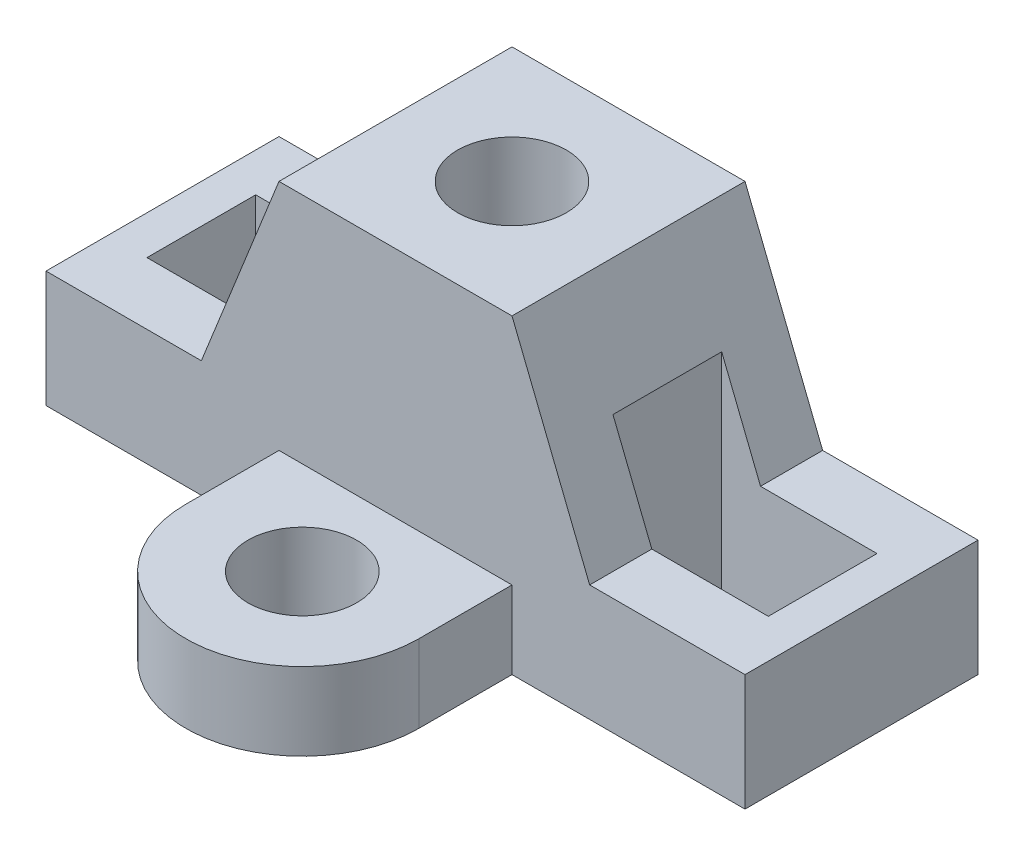
ISO-10303-21;
HEADER;
FILE_DESCRIPTION(('STEP AP214'),'2;1');
FILE_NAME('part.step','',(''),(''),'','','');
FILE_SCHEMA(('AUTOMOTIVE_DESIGN { 1 0 10303 214 1 1 1 1 }'));
ENDSEC;
DATA;
#1=APPLICATION_CONTEXT('core data for automotive mechanical design processes');
#2=APPLICATION_PROTOCOL_DEFINITION('international standard','automotive_design',2000,#1);
#3=PRODUCT_CONTEXT('',#1,'mechanical');
#4=PRODUCT('Part','Part','',(#3));
#5=PRODUCT_RELATED_PRODUCT_CATEGORY('part','',(#4));
#6=PRODUCT_DEFINITION_FORMATION('','',#4);
#7=PRODUCT_DEFINITION_CONTEXT('part definition',#1,'design');
#8=PRODUCT_DEFINITION('design','',#6,#7);
#9=PRODUCT_DEFINITION_SHAPE('','',#8);
#10=(LENGTH_UNIT() NAMED_UNIT(*) SI_UNIT(.MILLI.,.METRE.));
#11=(NAMED_UNIT(*) PLANE_ANGLE_UNIT() SI_UNIT($,.RADIAN.));
#12=(NAMED_UNIT(*) SI_UNIT($,.STERADIAN.) SOLID_ANGLE_UNIT());
#13=UNCERTAINTY_MEASURE_WITH_UNIT(LENGTH_MEASURE(1.E-05),#10,'distance_accuracy_value','');
#14=(GEOMETRIC_REPRESENTATION_CONTEXT(3) GLOBAL_UNCERTAINTY_ASSIGNED_CONTEXT((#13)) GLOBAL_UNIT_ASSIGNED_CONTEXT((#10,
#11,#12)) REPRESENTATION_CONTEXT('',''));
#15=CARTESIAN_POINT('',(0.,0.,0.));
#16=DIRECTION('',(0.,0.,1.));
#17=DIRECTION('',(1.,0.,0.));
#18=AXIS2_PLACEMENT_3D('',#15,#16,#17);
#19=CARTESIAN_POINT('',(25.,15.,-30.));
#20=DIRECTION('',(0.928476690885259,0.371390676354104,0.));
#21=DIRECTION('',(-0.371390676354104,0.928476690885259,0.));
#22=AXIS2_PLACEMENT_3D('',#19,#20,#21);
#23=PLANE('',#22);
#24=DIRECTION('',(-0.371390676354104,0.928476690885259,0.));
#25=VECTOR('',#24,1.);
#26=CARTESIAN_POINT('',(25.,15.,-22.));
#27=LINE('',#26,#25);
#28=CARTESIAN_POINT('',(25.,15.,-22.));
#29=VERTEX_POINT('',#28);
#30=CARTESIAN_POINT('',(20.,27.5,-22.));
#31=VERTEX_POINT('',#30);
#32=EDGE_CURVE('E299',#29,#31,#27,.T.);
#33=ORIENTED_EDGE('',*,*,#32,.F.);
#34=DIRECTION('',(0.,0.,1.));
#35=VECTOR('',#34,1.);
#36=CARTESIAN_POINT('',(25.,15.,-30.));
#37=LINE('',#36,#35);
#38=CARTESIAN_POINT('',(25.,15.,-30.));
#39=VERTEX_POINT('',#38);
#40=EDGE_CURVE('E365',#39,#29,#37,.T.);
#41=ORIENTED_EDGE('',*,*,#40,.F.);
#42=DIRECTION('',(-0.371390676354104,0.928476690885259,0.));
#43=VECTOR('',#42,1.);
#44=CARTESIAN_POINT('',(25.,15.,-30.));
#45=LINE('',#44,#43);
#46=CARTESIAN_POINT('',(15.,40.,-30.));
#47=VERTEX_POINT('',#46);
#48=EDGE_CURVE('E303',#39,#47,#45,.T.);
#49=ORIENTED_EDGE('',*,*,#48,.T.);
#50=DIRECTION('',(0.,0.,1.));
#51=VECTOR('',#50,1.);
#52=CARTESIAN_POINT('',(15.,40.,-30.));
#53=LINE('',#52,#51);
#54=CARTESIAN_POINT('',(15.,40.,0.));
#55=VERTEX_POINT('',#54);
#56=EDGE_CURVE('E336',#47,#55,#53,.T.);
#57=ORIENTED_EDGE('',*,*,#56,.T.);
#58=DIRECTION('',(-0.371390676354104,0.928476690885259,0.));
#59=VECTOR('',#58,1.);
#60=CARTESIAN_POINT('',(25.,15.,0.));
#61=LINE('',#60,#59);
#62=CARTESIAN_POINT('',(25.,15.,0.));
#63=VERTEX_POINT('',#62);
#64=EDGE_CURVE('E302',#63,#55,#61,.T.);
#65=ORIENTED_EDGE('',*,*,#64,.F.);
#66=CARTESIAN_POINT('',(25.,15.,-8.));
#67=VERTEX_POINT('',#66);
#68=EDGE_CURVE('E370',#67,#63,#37,.T.);
#69=ORIENTED_EDGE('',*,*,#68,.F.);
#70=DIRECTION('',(0.371390676354104,-0.928476690885259,0.));
#71=VECTOR('',#70,1.);
#72=CARTESIAN_POINT('',(25.,15.,-8.));
#73=LINE('',#72,#71);
#74=CARTESIAN_POINT('',(20.,27.5,-8.));
#75=VERTEX_POINT('',#74);
#76=EDGE_CURVE('E66',#75,#67,#73,.T.);
#77=ORIENTED_EDGE('',*,*,#76,.F.);
#78=DIRECTION('',(0.,0.,1.));
#79=VECTOR('',#78,1.);
#80=CARTESIAN_POINT('',(20.,27.5,-30.));
#81=LINE('',#80,#79);
#82=EDGE_CURVE('E285',#31,#75,#81,.T.);
#83=ORIENTED_EDGE('',*,*,#82,.F.);
#84=EDGE_LOOP('',(#33,#41,#49,#57,#65,#69,#77,#83));
#85=FACE_BOUND('',#84,.T.);
#86=ADVANCED_FACE('F43',(#85),#23,.T.);
#87=CARTESIAN_POINT('',(45.,15.,-30.));
#88=DIRECTION('',(0.,1.,0.));
#89=DIRECTION('',(-1.,0.,0.));
#90=AXIS2_PLACEMENT_3D('',#87,#88,#89);
#91=PLANE('',#90);
#92=DIRECTION('',(-1.,0.,0.));
#93=VECTOR('',#92,1.);
#94=CARTESIAN_POINT('',(45.,15.,-22.));
#95=LINE('',#94,#93);
#96=CARTESIAN_POINT('',(40.,15.,-22.));
#97=VERTEX_POINT('',#96);
#98=EDGE_CURVE('E296',#97,#29,#95,.T.);
#99=ORIENTED_EDGE('',*,*,#98,.F.);
#100=DIRECTION('',(0.,0.,-1.));
#101=VECTOR('',#100,1.);
#102=CARTESIAN_POINT('',(40.,15.,-30.));
#103=LINE('',#102,#101);
#104=CARTESIAN_POINT('',(40.,15.,-8.));
#105=VERTEX_POINT('',#104);
#106=EDGE_CURVE('E293',#105,#97,#103,.T.);
#107=ORIENTED_EDGE('',*,*,#106,.F.);
#108=DIRECTION('',(1.,0.,0.));
#109=VECTOR('',#108,1.);
#110=CARTESIAN_POINT('',(45.,15.,-8.));
#111=LINE('',#110,#109);
#112=EDGE_CURVE('E288',#67,#105,#111,.T.);
#113=ORIENTED_EDGE('',*,*,#112,.F.);
#114=ORIENTED_EDGE('',*,*,#68,.T.);
#115=DIRECTION('',(-1.,0.,0.));
#116=VECTOR('',#115,1.);
#117=CARTESIAN_POINT('',(45.,15.,0.));
#118=LINE('',#117,#116);
#119=CARTESIAN_POINT('',(45.,15.,0.));
#120=VERTEX_POINT('',#119);
#121=EDGE_CURVE('E308',#120,#63,#118,.T.);
#122=ORIENTED_EDGE('',*,*,#121,.F.);
#123=DIRECTION('',(0.,0.,1.));
#124=VECTOR('',#123,1.);
#125=CARTESIAN_POINT('',(45.,15.,-30.));
#126=LINE('',#125,#124);
#127=CARTESIAN_POINT('',(45.,15.,-30.));
#128=VERTEX_POINT('',#127);
#129=EDGE_CURVE('E371',#128,#120,#126,.T.);
#130=ORIENTED_EDGE('',*,*,#129,.F.);
#131=DIRECTION('',(-1.,0.,0.));
#132=VECTOR('',#131,1.);
#133=CARTESIAN_POINT('',(45.,15.,-30.));
#134=LINE('',#133,#132);
#135=EDGE_CURVE('E332',#128,#39,#134,.T.);
#136=ORIENTED_EDGE('',*,*,#135,.T.);
#137=ORIENTED_EDGE('',*,*,#40,.T.);
#138=EDGE_LOOP('',(#99,#107,#113,#114,#122,#130,#136,#137));
#139=FACE_BOUND('',#138,.T.);
#140=ADVANCED_FACE('F436',(#139),#91,.T.);
#141=CARTESIAN_POINT('',(45.,0.,-30.));
#142=DIRECTION('',(1.,0.,0.));
#143=DIRECTION('',(0.,0.,-1.));
#144=AXIS2_PLACEMENT_3D('',#141,#142,#143);
#145=PLANE('',#144);
#146=DIRECTION('',(0.,1.,0.));
#147=VECTOR('',#146,1.);
#148=CARTESIAN_POINT('',(45.,0.,0.));
#149=LINE('',#148,#147);
#150=CARTESIAN_POINT('',(45.,0.,0.));
#151=VERTEX_POINT('',#150);
#152=EDGE_CURVE('E358',#151,#120,#149,.T.);
#153=ORIENTED_EDGE('',*,*,#152,.F.);
#154=DIRECTION('',(0.,0.,1.));
#155=VECTOR('',#154,1.);
#156=CARTESIAN_POINT('',(45.,0.,-30.));
#157=LINE('',#156,#155);
#158=CARTESIAN_POINT('',(45.,0.,-30.));
#159=VERTEX_POINT('',#158);
#160=EDGE_CURVE('E374',#159,#151,#157,.T.);
#161=ORIENTED_EDGE('',*,*,#160,.F.);
#162=DIRECTION('',(0.,1.,0.));
#163=VECTOR('',#162,1.);
#164=CARTESIAN_POINT('',(45.,0.,-30.));
#165=LINE('',#164,#163);
#166=EDGE_CURVE('E328',#159,#128,#165,.T.);
#167=ORIENTED_EDGE('',*,*,#166,.T.);
#168=ORIENTED_EDGE('',*,*,#129,.T.);
#169=EDGE_LOOP('',(#153,#161,#167,#168));
#170=FACE_BOUND('',#169,.T.);
#171=ADVANCED_FACE('F459',(#170),#145,.T.);
#172=CARTESIAN_POINT('',(-45.,0.,-30.));
#173=DIRECTION('',(0.,-1.,0.));
#174=DIRECTION('',(0.,0.,-1.));
#175=AXIS2_PLACEMENT_3D('',#172,#173,#174);
#176=PLANE('',#175);
#177=CARTESIAN_POINT('',(0.,0.,-15.));
#178=DIRECTION('',(0.,-1.,0.));
#179=DIRECTION('',(0.,0.,-1.));
#180=AXIS2_PLACEMENT_3D('',#177,#178,#179);
#181=CIRCLE('',#180,7.);
#182=CARTESIAN_POINT('',(0.,0.,-22.));
#183=VERTEX_POINT('',#182);
#184=EDGE_CURVE('E226',#183,#183,#181,.F.);
#185=ORIENTED_EDGE('',*,*,#184,.T.);
#186=EDGE_LOOP('',(#185));
#187=FACE_BOUND('',#186,.T.);
#188=DIRECTION('',(0.,0.,-1.));
#189=VECTOR('',#188,1.);
#190=CARTESIAN_POINT('',(-40.,0.,-30.));
#191=LINE('',#190,#189);
#192=CARTESIAN_POINT('',(-40.,0.,-8.));
#193=VERTEX_POINT('',#192);
#194=CARTESIAN_POINT('',(-40.,0.,-22.));
#195=VERTEX_POINT('',#194);
#196=EDGE_CURVE('E282',#193,#195,#191,.T.);
#197=ORIENTED_EDGE('',*,*,#196,.F.);
#198=DIRECTION('',(-1.,0.,0.));
#199=VECTOR('',#198,1.);
#200=CARTESIAN_POINT('',(-45.,0.,-8.));
#201=LINE('',#200,#199);
#202=CARTESIAN_POINT('',(-20.,0.,-8.));
#203=VERTEX_POINT('',#202);
#204=EDGE_CURVE('E269',#203,#193,#201,.T.);
#205=ORIENTED_EDGE('',*,*,#204,.F.);
#206=DIRECTION('',(0.,0.,1.));
#207=VECTOR('',#206,1.);
#208=CARTESIAN_POINT('',(-20.,0.,-30.));
#209=LINE('',#208,#207);
#210=CARTESIAN_POINT('',(-20.,0.,-22.));
#211=VERTEX_POINT('',#210);
#212=EDGE_CURVE('E272',#211,#203,#209,.T.);
#213=ORIENTED_EDGE('',*,*,#212,.F.);
#214=DIRECTION('',(1.,0.,0.));
#215=VECTOR('',#214,1.);
#216=CARTESIAN_POINT('',(-45.,0.,-22.));
#217=LINE('',#216,#215);
#218=EDGE_CURVE('E279',#195,#211,#217,.T.);
#219=ORIENTED_EDGE('',*,*,#218,.F.);
#220=EDGE_LOOP('',(#197,#205,#213,#219));
#221=FACE_BOUND('',#220,.T.);
#222=DIRECTION('',(1.,0.,0.));
#223=VECTOR('',#222,1.);
#224=CARTESIAN_POINT('',(-45.,0.,-22.));
#225=LINE('',#224,#223);
#226=CARTESIAN_POINT('',(20.,0.,-22.));
#227=VERTEX_POINT('',#226);
#228=CARTESIAN_POINT('',(40.,0.,-22.));
#229=VERTEX_POINT('',#228);
#230=EDGE_CURVE('E11',#227,#229,#225,.T.);
#231=ORIENTED_EDGE('',*,*,#230,.F.);
#232=DIRECTION('',(0.,0.,-1.));
#233=VECTOR('',#232,1.);
#234=CARTESIAN_POINT('',(20.,0.,-30.));
#235=LINE('',#234,#233);
#236=CARTESIAN_POINT('',(20.,0.,-8.));
#237=VERTEX_POINT('',#236);
#238=EDGE_CURVE('E405',#237,#227,#235,.T.);
#239=ORIENTED_EDGE('',*,*,#238,.F.);
#240=DIRECTION('',(-1.,0.,0.));
#241=VECTOR('',#240,1.);
#242=CARTESIAN_POINT('',(-45.,0.,-8.00000000000001));
#243=LINE('',#242,#241);
#244=CARTESIAN_POINT('',(40.,0.,-8.));
#245=VERTEX_POINT('',#244);
#246=EDGE_CURVE('E408',#245,#237,#243,.T.);
#247=ORIENTED_EDGE('',*,*,#246,.F.);
#248=DIRECTION('',(0.,0.,1.));
#249=VECTOR('',#248,1.);
#250=CARTESIAN_POINT('',(40.,0.,-30.));
#251=LINE('',#250,#249);
#252=EDGE_CURVE('E51',#229,#245,#251,.T.);
#253=ORIENTED_EDGE('',*,*,#252,.F.);
#254=EDGE_LOOP('',(#231,#239,#247,#253));
#255=FACE_BOUND('',#254,.T.);
#256=DIRECTION('',(1.,0.,0.));
#257=VECTOR('',#256,1.);
#258=CARTESIAN_POINT('',(-45.,0.,0.));
#259=LINE('',#258,#257);
#260=CARTESIAN_POINT('',(-45.,0.,0.));
#261=VERTEX_POINT('',#260);
#262=CARTESIAN_POINT('',(-15.,0.,0.));
#263=VERTEX_POINT('',#262);
#264=EDGE_CURVE('E219',#261,#263,#259,.T.);
#265=ORIENTED_EDGE('',*,*,#264,.F.);
#266=DIRECTION('',(0.,0.,1.));
#267=VECTOR('',#266,1.);
#268=CARTESIAN_POINT('',(-45.,0.,-30.));
#269=LINE('',#268,#267);
#270=CARTESIAN_POINT('',(-45.,0.,-30.));
#271=VERTEX_POINT('',#270);
#272=EDGE_CURVE('E378',#271,#261,#269,.T.);
#273=ORIENTED_EDGE('',*,*,#272,.F.);
#274=DIRECTION('',(1.,0.,0.));
#275=VECTOR('',#274,1.);
#276=CARTESIAN_POINT('',(-45.,0.,-30.));
#277=LINE('',#276,#275);
#278=EDGE_CURVE('E324',#271,#159,#277,.T.);
#279=ORIENTED_EDGE('',*,*,#278,.T.);
#280=ORIENTED_EDGE('',*,*,#160,.T.);
#281=CARTESIAN_POINT('',(15.,0.,0.));
#282=VERTEX_POINT('',#281);
#283=EDGE_CURVE('E355',#282,#151,#259,.T.);
#284=ORIENTED_EDGE('',*,*,#283,.F.);
#285=DIRECTION('',(0.,0.,-1.));
#286=VECTOR('',#285,1.);
#287=CARTESIAN_POINT('',(15.,0.,0.));
#288=LINE('',#287,#286);
#289=CARTESIAN_POINT('',(15.,0.,12.));
#290=VERTEX_POINT('',#289);
#291=EDGE_CURVE('E58',#290,#282,#288,.T.);
#292=ORIENTED_EDGE('',*,*,#291,.F.);
#293=CARTESIAN_POINT('',(0.,0.,12.));
#294=DIRECTION('',(0.,1.,0.));
#295=DIRECTION('',(0.,0.,1.));
#296=AXIS2_PLACEMENT_3D('',#293,#294,#295);
#297=CIRCLE('',#296,15.);
#298=CARTESIAN_POINT('',(-15.,0.,12.));
#299=VERTEX_POINT('',#298);
#300=EDGE_CURVE('E745',#299,#290,#297,.T.);
#301=ORIENTED_EDGE('',*,*,#300,.F.);
#302=DIRECTION('',(0.,0.,1.));
#303=VECTOR('',#302,1.);
#304=CARTESIAN_POINT('',(-15.,0.,0.));
#305=LINE('',#304,#303);
#306=EDGE_CURVE('E744',#263,#299,#305,.T.);
#307=ORIENTED_EDGE('',*,*,#306,.F.);
#308=EDGE_LOOP('',(#265,#273,#279,#280,#284,#292,#301,#307));
#309=FACE_BOUND('',#308,.T.);
#310=CARTESIAN_POINT('',(0.,0.,12.));
#311=DIRECTION('',(0.,1.,0.));
#312=DIRECTION('',(0.,0.,1.));
#313=AXIS2_PLACEMENT_3D('',#310,#311,#312);
#314=CIRCLE('',#313,7.);
#315=CARTESIAN_POINT('',(0.,0.,19.));
#316=VERTEX_POINT('',#315);
#317=EDGE_CURVE('E753',#316,#316,#314,.T.);
#318=ORIENTED_EDGE('',*,*,#317,.T.);
#319=EDGE_LOOP('',(#318));
#320=FACE_BOUND('',#319,.T.);
#321=ADVANCED_FACE('F423',(#187,#221,#255,#309,#320),#176,.T.);
#322=CARTESIAN_POINT('',(-45.,15.,-30.));
#323=DIRECTION('',(-1.,0.,0.));
#324=DIRECTION('',(0.,0.,1.));
#325=AXIS2_PLACEMENT_3D('',#322,#323,#324);
#326=PLANE('',#325);
#327=DIRECTION('',(0.,-1.,0.));
#328=VECTOR('',#327,1.);
#329=CARTESIAN_POINT('',(-45.,15.,0.));
#330=LINE('',#329,#328);
#331=CARTESIAN_POINT('',(-45.,15.,0.));
#332=VERTEX_POINT('',#331);
#333=EDGE_CURVE('E352',#332,#261,#330,.T.);
#334=ORIENTED_EDGE('',*,*,#333,.F.);
#335=DIRECTION('',(0.,0.,1.));
#336=VECTOR('',#335,1.);
#337=CARTESIAN_POINT('',(-45.,15.,-30.));
#338=LINE('',#337,#336);
#339=CARTESIAN_POINT('',(-45.,15.,-30.));
#340=VERTEX_POINT('',#339);
#341=EDGE_CURVE('E381',#340,#332,#338,.T.);
#342=ORIENTED_EDGE('',*,*,#341,.F.);
#343=DIRECTION('',(0.,-1.,0.));
#344=VECTOR('',#343,1.);
#345=CARTESIAN_POINT('',(-45.,15.,-30.));
#346=LINE('',#345,#344);
#347=EDGE_CURVE('E320',#340,#271,#346,.T.);
#348=ORIENTED_EDGE('',*,*,#347,.T.);
#349=ORIENTED_EDGE('',*,*,#272,.T.);
#350=EDGE_LOOP('',(#334,#342,#348,#349));
#351=FACE_BOUND('',#350,.T.);
#352=ADVANCED_FACE('F466',(#351),#326,.T.);
#353=CARTESIAN_POINT('',(-25.,15.,-30.));
#354=DIRECTION('',(0.,1.,0.));
#355=DIRECTION('',(0.,0.,1.));
#356=AXIS2_PLACEMENT_3D('',#353,#354,#355);
#357=PLANE('',#356);
#358=DIRECTION('',(-1.,0.,0.));
#359=VECTOR('',#358,1.);
#360=CARTESIAN_POINT('',(-25.,15.,-22.));
#361=LINE('',#360,#359);
#362=CARTESIAN_POINT('',(-25.,15.,-22.));
#363=VERTEX_POINT('',#362);
#364=CARTESIAN_POINT('',(-40.,15.,-22.));
#365=VERTEX_POINT('',#364);
#366=EDGE_CURVE('E276',#363,#365,#361,.T.);
#367=ORIENTED_EDGE('',*,*,#366,.F.);
#368=DIRECTION('',(0.,0.,1.));
#369=VECTOR('',#368,1.);
#370=CARTESIAN_POINT('',(-25.,15.,-30.));
#371=LINE('',#370,#369);
#372=CARTESIAN_POINT('',(-25.,15.,-30.));
#373=VERTEX_POINT('',#372);
#374=EDGE_CURVE('E384',#373,#363,#371,.T.);
#375=ORIENTED_EDGE('',*,*,#374,.F.);
#376=DIRECTION('',(-1.,0.,0.));
#377=VECTOR('',#376,1.);
#378=CARTESIAN_POINT('',(-25.,15.,-30.));
#379=LINE('',#378,#377);
#380=EDGE_CURVE('E316',#373,#340,#379,.T.);
#381=ORIENTED_EDGE('',*,*,#380,.T.);
#382=ORIENTED_EDGE('',*,*,#341,.T.);
#383=DIRECTION('',(-1.,0.,0.));
#384=VECTOR('',#383,1.);
#385=CARTESIAN_POINT('',(-25.,15.,0.));
#386=LINE('',#385,#384);
#387=CARTESIAN_POINT('',(-25.,15.,0.));
#388=VERTEX_POINT('',#387);
#389=EDGE_CURVE('E348',#388,#332,#386,.T.);
#390=ORIENTED_EDGE('',*,*,#389,.F.);
#391=CARTESIAN_POINT('',(-25.,15.,-8.));
#392=VERTEX_POINT('',#391);
#393=EDGE_CURVE('E388',#392,#388,#371,.T.);
#394=ORIENTED_EDGE('',*,*,#393,.F.);
#395=DIRECTION('',(1.,0.,0.));
#396=VECTOR('',#395,1.);
#397=CARTESIAN_POINT('',(-25.,15.,-8.));
#398=LINE('',#397,#396);
#399=CARTESIAN_POINT('',(-40.,15.,-8.));
#400=VERTEX_POINT('',#399);
#401=EDGE_CURVE('E240',#400,#392,#398,.T.);
#402=ORIENTED_EDGE('',*,*,#401,.F.);
#403=DIRECTION('',(0.,0.,1.));
#404=VECTOR('',#403,1.);
#405=CARTESIAN_POINT('',(-40.,15.,-30.));
#406=LINE('',#405,#404);
#407=EDGE_CURVE('E402',#365,#400,#406,.T.);
#408=ORIENTED_EDGE('',*,*,#407,.F.);
#409=EDGE_LOOP('',(#367,#375,#381,#382,#390,#394,#402,#408));
#410=FACE_BOUND('',#409,.T.);
#411=ADVANCED_FACE('F485',(#410),#357,.T.);
#412=CARTESIAN_POINT('',(-15.,40.,-30.));
#413=DIRECTION('',(-0.928476690885259,0.371390676354104,0.));
#414=DIRECTION('',(-0.371390676354104,-0.928476690885259,0.));
#415=AXIS2_PLACEMENT_3D('',#412,#413,#414);
#416=PLANE('',#415);
#417=DIRECTION('',(-0.371390676354104,-0.928476690885259,0.));
#418=VECTOR('',#417,1.);
#419=CARTESIAN_POINT('',(-15.,40.,-22.));
#420=LINE('',#419,#418);
#421=CARTESIAN_POINT('',(-20.,27.5,-22.));
#422=VERTEX_POINT('',#421);
#423=EDGE_CURVE('E399',#422,#363,#420,.T.);
#424=ORIENTED_EDGE('',*,*,#423,.F.);
#425=DIRECTION('',(0.,0.,-1.));
#426=VECTOR('',#425,1.);
#427=CARTESIAN_POINT('',(-20.,27.5,-30.));
#428=LINE('',#427,#426);
#429=CARTESIAN_POINT('',(-20.,27.4999999999999,-8.));
#430=VERTEX_POINT('',#429);
#431=EDGE_CURVE('E396',#430,#422,#428,.T.);
#432=ORIENTED_EDGE('',*,*,#431,.F.);
#433=DIRECTION('',(0.371390676354104,0.928476690885259,0.));
#434=VECTOR('',#433,1.);
#435=CARTESIAN_POINT('',(-15.,40.,-8.));
#436=LINE('',#435,#434);
#437=EDGE_CURVE('E369',#392,#430,#436,.T.);
#438=ORIENTED_EDGE('',*,*,#437,.F.);
#439=ORIENTED_EDGE('',*,*,#393,.T.);
#440=DIRECTION('',(-0.371390676354104,-0.928476690885259,0.));
#441=VECTOR('',#440,1.);
#442=CARTESIAN_POINT('',(-15.,40.,0.));
#443=LINE('',#442,#441);
#444=CARTESIAN_POINT('',(-15.,40.,0.));
#445=VERTEX_POINT('',#444);
#446=EDGE_CURVE('E344',#445,#388,#443,.T.);
#447=ORIENTED_EDGE('',*,*,#446,.F.);
#448=DIRECTION('',(0.,0.,1.));
#449=VECTOR('',#448,1.);
#450=CARTESIAN_POINT('',(-15.,40.,-30.));
#451=LINE('',#450,#449);
#452=CARTESIAN_POINT('',(-15.,40.,-30.));
#453=VERTEX_POINT('',#452);
#454=EDGE_CURVE('E389',#453,#445,#451,.T.);
#455=ORIENTED_EDGE('',*,*,#454,.F.);
#456=DIRECTION('',(-0.371390676354104,-0.928476690885259,0.));
#457=VECTOR('',#456,1.);
#458=CARTESIAN_POINT('',(-15.,40.,-30.));
#459=LINE('',#458,#457);
#460=EDGE_CURVE('E312',#453,#373,#459,.T.);
#461=ORIENTED_EDGE('',*,*,#460,.T.);
#462=ORIENTED_EDGE('',*,*,#374,.T.);
#463=EDGE_LOOP('',(#424,#432,#438,#439,#447,#455,#461,#462));
#464=FACE_BOUND('',#463,.T.);
#465=ADVANCED_FACE('F490',(#464),#416,.T.);
#466=CARTESIAN_POINT('',(15.,40.,-30.));
#467=DIRECTION('',(0.,1.,0.));
#468=DIRECTION('',(0.,0.,1.));
#469=AXIS2_PLACEMENT_3D('',#466,#467,#468);
#470=PLANE('',#469);
#471=CARTESIAN_POINT('',(0.,40.,-15.));
#472=DIRECTION('',(0.,1.,0.));
#473=DIRECTION('',(0.,0.,1.));
#474=AXIS2_PLACEMENT_3D('',#471,#472,#473);
#475=CIRCLE('',#474,7.);
#476=CARTESIAN_POINT('',(0.,40.,-8.));
#477=VERTEX_POINT('',#476);
#478=EDGE_CURVE('E221',#477,#477,#475,.T.);
#479=ORIENTED_EDGE('',*,*,#478,.F.);
#480=EDGE_LOOP('',(#479));
#481=FACE_BOUND('',#480,.T.);
#482=DIRECTION('',(-1.,0.,0.));
#483=VECTOR('',#482,1.);
#484=CARTESIAN_POINT('',(15.,40.,0.));
#485=LINE('',#484,#483);
#486=EDGE_CURVE('E340',#55,#445,#485,.T.);
#487=ORIENTED_EDGE('',*,*,#486,.F.);
#488=ORIENTED_EDGE('',*,*,#56,.F.);
#489=DIRECTION('',(-1.,0.,0.));
#490=VECTOR('',#489,1.);
#491=CARTESIAN_POINT('',(15.,40.,-30.));
#492=LINE('',#491,#490);
#493=EDGE_CURVE('E307',#47,#453,#492,.T.);
#494=ORIENTED_EDGE('',*,*,#493,.T.);
#495=ORIENTED_EDGE('',*,*,#454,.T.);
#496=EDGE_LOOP('',(#487,#488,#494,#495));
#497=FACE_BOUND('',#496,.T.);
#498=ADVANCED_FACE('F449',(#481,#497),#470,.T.);
#499=CARTESIAN_POINT('',(0.,0.,-30.));
#500=DIRECTION('',(0.,0.,1.));
#501=DIRECTION('',(1.,0.,0.));
#502=AXIS2_PLACEMENT_3D('',#499,#500,#501);
#503=PLANE('',#502);
#504=ORIENTED_EDGE('',*,*,#48,.F.);
#505=ORIENTED_EDGE('',*,*,#135,.F.);
#506=ORIENTED_EDGE('',*,*,#166,.F.);
#507=ORIENTED_EDGE('',*,*,#278,.F.);
#508=ORIENTED_EDGE('',*,*,#347,.F.);
#509=ORIENTED_EDGE('',*,*,#380,.F.);
#510=ORIENTED_EDGE('',*,*,#460,.F.);
#511=ORIENTED_EDGE('',*,*,#493,.F.);
#512=EDGE_LOOP('',(#504,#505,#506,#507,#508,#509,#510,#511));
#513=FACE_BOUND('',#512,.T.);
#514=ADVANCED_FACE('F441',(#513),#503,.F.);
#515=CARTESIAN_POINT('',(0.,0.,0.));
#516=DIRECTION('',(0.,0.,1.));
#517=DIRECTION('',(1.,0.,0.));
#518=AXIS2_PLACEMENT_3D('',#515,#516,#517);
#519=PLANE('',#518);
#520=DIRECTION('',(0.,-1.,0.));
#521=VECTOR('',#520,1.);
#522=CARTESIAN_POINT('',(-15.,10.,0.));
#523=LINE('',#522,#521);
#524=CARTESIAN_POINT('',(-15.,10.,0.));
#525=VERTEX_POINT('',#524);
#526=EDGE_CURVE('E198',#525,#263,#523,.T.);
#527=ORIENTED_EDGE('',*,*,#526,.F.);
#528=DIRECTION('',(-1.,0.,0.));
#529=VECTOR('',#528,1.);
#530=CARTESIAN_POINT('',(-15.,10.,0.));
#531=LINE('',#530,#529);
#532=CARTESIAN_POINT('',(15.,10.,0.));
#533=VERTEX_POINT('',#532);
#534=EDGE_CURVE('E206',#533,#525,#531,.T.);
#535=ORIENTED_EDGE('',*,*,#534,.F.);
#536=DIRECTION('',(0.,-1.,0.));
#537=VECTOR('',#536,1.);
#538=CARTESIAN_POINT('',(15.,10.,0.));
#539=LINE('',#538,#537);
#540=EDGE_CURVE('E456',#533,#282,#539,.T.);
#541=ORIENTED_EDGE('',*,*,#540,.T.);
#542=ORIENTED_EDGE('',*,*,#283,.T.);
#543=ORIENTED_EDGE('',*,*,#152,.T.);
#544=ORIENTED_EDGE('',*,*,#121,.T.);
#545=ORIENTED_EDGE('',*,*,#64,.T.);
#546=ORIENTED_EDGE('',*,*,#486,.T.);
#547=ORIENTED_EDGE('',*,*,#446,.T.);
#548=ORIENTED_EDGE('',*,*,#389,.T.);
#549=ORIENTED_EDGE('',*,*,#333,.T.);
#550=ORIENTED_EDGE('',*,*,#264,.T.);
#551=EDGE_LOOP('',(#527,#535,#541,#542,#543,#544,#545,#546,#547,#548,#549,#550));
#552=FACE_BOUND('',#551,.T.);
#553=ADVANCED_FACE('F216',(#552),#519,.T.);
#554=CARTESIAN_POINT('',(-40.,-1.2E-05,-8.));
#555=DIRECTION('',(-1.,0.,0.));
#556=DIRECTION('',(0.,0.,1.));
#557=AXIS2_PLACEMENT_3D('',#554,#555,#556);
#558=PLANE('',#557);
#559=ORIENTED_EDGE('',*,*,#196,.T.);
#560=DIRECTION('',(0.,1.,0.));
#561=VECTOR('',#560,1.);
#562=CARTESIAN_POINT('',(-40.,-1.2E-05,-22.));
#563=LINE('',#562,#561);
#564=EDGE_CURVE('E236',#195,#365,#563,.T.);
#565=ORIENTED_EDGE('',*,*,#564,.T.);
#566=ORIENTED_EDGE('',*,*,#407,.T.);
#567=DIRECTION('',(0.,1.,0.));
#568=VECTOR('',#567,1.);
#569=CARTESIAN_POINT('',(-40.,-1.2E-05,-8.));
#570=LINE('',#569,#568);
#571=EDGE_CURVE('E249',#193,#400,#570,.T.);
#572=ORIENTED_EDGE('',*,*,#571,.F.);
#573=EDGE_LOOP('',(#559,#565,#566,#572));
#574=FACE_BOUND('',#573,.T.);
#575=ADVANCED_FACE('F511',(#574),#558,.F.);
#576=CARTESIAN_POINT('',(-40.,-1.2E-05,-22.));
#577=DIRECTION('',(0.,0.,-1.));
#578=DIRECTION('',(-1.,0.,0.));
#579=AXIS2_PLACEMENT_3D('',#576,#577,#578);
#580=PLANE('',#579);
#581=ORIENTED_EDGE('',*,*,#218,.T.);
#582=DIRECTION('',(0.,1.,0.));
#583=VECTOR('',#582,1.);
#584=CARTESIAN_POINT('',(-20.,-1.2E-05,-22.));
#585=LINE('',#584,#583);
#586=EDGE_CURVE('E241',#211,#422,#585,.T.);
#587=ORIENTED_EDGE('',*,*,#586,.T.);
#588=ORIENTED_EDGE('',*,*,#423,.T.);
#589=ORIENTED_EDGE('',*,*,#366,.T.);
#590=ORIENTED_EDGE('',*,*,#564,.F.);
#591=EDGE_LOOP('',(#581,#587,#588,#589,#590));
#592=FACE_BOUND('',#591,.T.);
#593=ADVANCED_FACE('F516',(#592),#580,.F.);
#594=CARTESIAN_POINT('',(-20.,-1.2E-05,-22.));
#595=DIRECTION('',(1.,0.,0.));
#596=DIRECTION('',(0.,0.,-1.));
#597=AXIS2_PLACEMENT_3D('',#594,#595,#596);
#598=PLANE('',#597);
#599=ORIENTED_EDGE('',*,*,#212,.T.);
#600=DIRECTION('',(0.,1.,0.));
#601=VECTOR('',#600,1.);
#602=CARTESIAN_POINT('',(-20.,-1.2E-05,-8.));
#603=LINE('',#602,#601);
#604=EDGE_CURVE('E245',#203,#430,#603,.T.);
#605=ORIENTED_EDGE('',*,*,#604,.T.);
#606=ORIENTED_EDGE('',*,*,#431,.T.);
#607=ORIENTED_EDGE('',*,*,#586,.F.);
#608=EDGE_LOOP('',(#599,#605,#606,#607));
#609=FACE_BOUND('',#608,.T.);
#610=ADVANCED_FACE('F529',(#609),#598,.F.);
#611=CARTESIAN_POINT('',(-20.,-1.2E-05,-8.));
#612=DIRECTION('',(0.,0.,1.));
#613=DIRECTION('',(1.,0.,0.));
#614=AXIS2_PLACEMENT_3D('',#611,#612,#613);
#615=PLANE('',#614);
#616=ORIENTED_EDGE('',*,*,#204,.T.);
#617=ORIENTED_EDGE('',*,*,#571,.T.);
#618=ORIENTED_EDGE('',*,*,#401,.T.);
#619=ORIENTED_EDGE('',*,*,#437,.T.);
#620=ORIENTED_EDGE('',*,*,#604,.F.);
#621=EDGE_LOOP('',(#616,#617,#618,#619,#620));
#622=FACE_BOUND('',#621,.T.);
#623=ADVANCED_FACE('F540',(#622),#615,.F.);
#624=CARTESIAN_POINT('',(40.,-1.2E-05,-22.));
#625=DIRECTION('',(0.,0.,-1.));
#626=DIRECTION('',(-1.,0.,0.));
#627=AXIS2_PLACEMENT_3D('',#624,#625,#626);
#628=PLANE('',#627);
#629=ORIENTED_EDGE('',*,*,#32,.T.);
#630=DIRECTION('',(0.,1.,0.));
#631=VECTOR('',#630,1.);
#632=CARTESIAN_POINT('',(20.,-1.2E-05,-22.));
#633=LINE('',#632,#631);
#634=EDGE_CURVE('E253',#227,#31,#633,.T.);
#635=ORIENTED_EDGE('',*,*,#634,.F.);
#636=ORIENTED_EDGE('',*,*,#230,.T.);
#637=DIRECTION('',(0.,1.,0.));
#638=VECTOR('',#637,1.);
#639=CARTESIAN_POINT('',(40.,-1.2E-05,-22.));
#640=LINE('',#639,#638);
#641=EDGE_CURVE('E235',#229,#97,#640,.T.);
#642=ORIENTED_EDGE('',*,*,#641,.T.);
#643=ORIENTED_EDGE('',*,*,#98,.T.);
#644=EDGE_LOOP('',(#629,#635,#636,#642,#643));
#645=FACE_BOUND('',#644,.T.);
#646=ADVANCED_FACE('F430',(#645),#628,.F.);
#647=CARTESIAN_POINT('',(40.,-1.2E-05,-8.));
#648=DIRECTION('',(1.,0.,0.));
#649=DIRECTION('',(0.,0.,-1.));
#650=AXIS2_PLACEMENT_3D('',#647,#648,#649);
#651=PLANE('',#650);
#652=ORIENTED_EDGE('',*,*,#106,.T.);
#653=ORIENTED_EDGE('',*,*,#641,.F.);
#654=ORIENTED_EDGE('',*,*,#252,.T.);
#655=DIRECTION('',(0.,1.,0.));
#656=VECTOR('',#655,1.);
#657=CARTESIAN_POINT('',(40.,-1.2E-05,-8.));
#658=LINE('',#657,#656);
#659=EDGE_CURVE('E260',#245,#105,#658,.T.);
#660=ORIENTED_EDGE('',*,*,#659,.T.);
#661=EDGE_LOOP('',(#652,#653,#654,#660));
#662=FACE_BOUND('',#661,.T.);
#663=ADVANCED_FACE('F416',(#662),#651,.F.);
#664=CARTESIAN_POINT('',(20.,-1.2E-05,-8.));
#665=DIRECTION('',(0.,0.,1.));
#666=DIRECTION('',(1.,0.,0.));
#667=AXIS2_PLACEMENT_3D('',#664,#665,#666);
#668=PLANE('',#667);
#669=ORIENTED_EDGE('',*,*,#76,.T.);
#670=ORIENTED_EDGE('',*,*,#112,.T.);
#671=ORIENTED_EDGE('',*,*,#659,.F.);
#672=ORIENTED_EDGE('',*,*,#246,.T.);
#673=DIRECTION('',(0.,1.,0.));
#674=VECTOR('',#673,1.);
#675=CARTESIAN_POINT('',(20.,-1.2E-05,-8.));
#676=LINE('',#675,#674);
#677=EDGE_CURVE('E257',#237,#75,#676,.T.);
#678=ORIENTED_EDGE('',*,*,#677,.T.);
#679=EDGE_LOOP('',(#669,#670,#671,#672,#678));
#680=FACE_BOUND('',#679,.T.);
#681=ADVANCED_FACE('F421',(#680),#668,.F.);
#682=CARTESIAN_POINT('',(20.,-1.2E-05,-22.));
#683=DIRECTION('',(-1.,0.,0.));
#684=DIRECTION('',(0.,0.,1.));
#685=AXIS2_PLACEMENT_3D('',#682,#683,#684);
#686=PLANE('',#685);
#687=ORIENTED_EDGE('',*,*,#82,.T.);
#688=ORIENTED_EDGE('',*,*,#677,.F.);
#689=ORIENTED_EDGE('',*,*,#238,.T.);
#690=ORIENTED_EDGE('',*,*,#634,.T.);
#691=EDGE_LOOP('',(#687,#688,#689,#690));
#692=FACE_BOUND('',#691,.T.);
#693=ADVANCED_FACE('F427',(#692),#686,.F.);
#694=CARTESIAN_POINT('',(0.,40.,-15.));
#695=DIRECTION('',(0.,-1.,0.));
#696=DIRECTION('',(0.,0.,-1.));
#697=AXIS2_PLACEMENT_3D('',#694,#695,#696);
#698=CYLINDRICAL_SURFACE('',#697,7.);
#699=ORIENTED_EDGE('',*,*,#184,.F.);
#700=EDGE_LOOP('',(#699));
#701=FACE_BOUND('',#700,.T.);
#702=ORIENTED_EDGE('',*,*,#478,.T.);
#703=EDGE_LOOP('',(#702));
#704=FACE_BOUND('',#703,.T.);
#705=ADVANCED_FACE('F588',(#701,#704),#698,.F.);
#706=CARTESIAN_POINT('',(0.,10.,12.));
#707=DIRECTION('',(0.,1.,0.));
#708=DIRECTION('',(0.,0.,1.));
#709=AXIS2_PLACEMENT_3D('',#706,#707,#708);
#710=PLANE('',#709);
#711=ORIENTED_EDGE('',*,*,#534,.T.);
#712=DIRECTION('',(0.,0.,1.));
#713=VECTOR('',#712,1.);
#714=CARTESIAN_POINT('',(-15.,10.,0.));
#715=LINE('',#714,#713);
#716=CARTESIAN_POINT('',(-15.,10.,12.));
#717=VERTEX_POINT('',#716);
#718=EDGE_CURVE('E194',#525,#717,#715,.T.);
#719=ORIENTED_EDGE('',*,*,#718,.T.);
#720=CARTESIAN_POINT('',(0.,10.,12.));
#721=DIRECTION('',(0.,1.,0.));
#722=DIRECTION('',(0.,0.,1.));
#723=AXIS2_PLACEMENT_3D('',#720,#721,#722);
#724=CIRCLE('',#723,15.);
#725=CARTESIAN_POINT('',(15.,10.,12.));
#726=VERTEX_POINT('',#725);
#727=EDGE_CURVE('E205',#717,#726,#724,.T.);
#728=ORIENTED_EDGE('',*,*,#727,.T.);
#729=DIRECTION('',(0.,0.,-1.));
#730=VECTOR('',#729,1.);
#731=CARTESIAN_POINT('',(15.,10.,0.));
#732=LINE('',#731,#730);
#733=EDGE_CURVE('E212',#726,#533,#732,.T.);
#734=ORIENTED_EDGE('',*,*,#733,.T.);
#735=EDGE_LOOP('',(#711,#719,#728,#734));
#736=FACE_BOUND('',#735,.T.);
#737=CARTESIAN_POINT('',(0.,10.,12.));
#738=DIRECTION('',(0.,1.,0.));
#739=DIRECTION('',(0.,0.,1.));
#740=AXIS2_PLACEMENT_3D('',#737,#738,#739);
#741=CIRCLE('',#740,7.);
#742=CARTESIAN_POINT('',(0.,10.,19.));
#743=VERTEX_POINT('',#742);
#744=EDGE_CURVE('E747',#743,#743,#741,.T.);
#745=ORIENTED_EDGE('',*,*,#744,.F.);
#746=EDGE_LOOP('',(#745));
#747=FACE_BOUND('',#746,.T.);
#748=ADVANCED_FACE('F209',(#736,#747),#710,.T.);
#749=CARTESIAN_POINT('',(-15.,10.,0.));
#750=DIRECTION('',(1.,0.,0.));
#751=DIRECTION('',(0.,0.,-1.));
#752=AXIS2_PLACEMENT_3D('',#749,#750,#751);
#753=PLANE('',#752);
#754=ORIENTED_EDGE('',*,*,#306,.T.);
#755=DIRECTION('',(0.,-1.,0.));
#756=VECTOR('',#755,1.);
#757=CARTESIAN_POINT('',(-15.,10.,12.));
#758=LINE('',#757,#756);
#759=EDGE_CURVE('E201',#717,#299,#758,.T.);
#760=ORIENTED_EDGE('',*,*,#759,.F.);
#761=ORIENTED_EDGE('',*,*,#718,.F.);
#762=ORIENTED_EDGE('',*,*,#526,.T.);
#763=EDGE_LOOP('',(#754,#760,#761,#762));
#764=FACE_BOUND('',#763,.T.);
#765=ADVANCED_FACE('F196',(#764),#753,.F.);
#766=CARTESIAN_POINT('',(0.,10.,12.));
#767=DIRECTION('',(0.,-1.,0.));
#768=DIRECTION('',(0.,0.,-1.));
#769=AXIS2_PLACEMENT_3D('',#766,#767,#768);
#770=CYLINDRICAL_SURFACE('',#769,15.);
#771=ORIENTED_EDGE('',*,*,#300,.T.);
#772=DIRECTION('',(0.,-1.,0.));
#773=VECTOR('',#772,1.);
#774=CARTESIAN_POINT('',(15.,10.,12.));
#775=LINE('',#774,#773);
#776=EDGE_CURVE('E228',#726,#290,#775,.T.);
#777=ORIENTED_EDGE('',*,*,#776,.F.);
#778=ORIENTED_EDGE('',*,*,#727,.F.);
#779=ORIENTED_EDGE('',*,*,#759,.T.);
#780=EDGE_LOOP('',(#771,#777,#778,#779));
#781=FACE_BOUND('',#780,.T.);
#782=ADVANCED_FACE('F640',(#781),#770,.T.);
#783=CARTESIAN_POINT('',(15.,10.,0.));
#784=DIRECTION('',(-1.,0.,0.));
#785=DIRECTION('',(0.,0.,1.));
#786=AXIS2_PLACEMENT_3D('',#783,#784,#785);
#787=PLANE('',#786);
#788=ORIENTED_EDGE('',*,*,#291,.T.);
#789=ORIENTED_EDGE('',*,*,#540,.F.);
#790=ORIENTED_EDGE('',*,*,#733,.F.);
#791=ORIENTED_EDGE('',*,*,#776,.T.);
#792=EDGE_LOOP('',(#788,#789,#790,#791));
#793=FACE_BOUND('',#792,.T.);
#794=ADVANCED_FACE('F650',(#793),#787,.F.);
#795=CARTESIAN_POINT('',(0.,10.,12.));
#796=DIRECTION('',(0.,-1.,0.));
#797=DIRECTION('',(0.,0.,-1.));
#798=AXIS2_PLACEMENT_3D('',#795,#796,#797);
#799=CYLINDRICAL_SURFACE('',#798,7.);
#800=ORIENTED_EDGE('',*,*,#744,.T.);
#801=EDGE_LOOP('',(#800));
#802=FACE_BOUND('',#801,.T.);
#803=ORIENTED_EDGE('',*,*,#317,.F.);
#804=EDGE_LOOP('',(#803));
#805=FACE_BOUND('',#804,.T.);
#806=ADVANCED_FACE('F661',(#802,#805),#799,.F.);
#807=CLOSED_SHELL('',(#86,#140,#171,#321,#352,#411,#465,#498,#514,#553,#575,#593,#610,#623,#646,
#663,#681,#693,#705,#748,#765,#782,#794,#806));
#808=MANIFOLD_SOLID_BREP('B2',#807);
#809=ADVANCED_BREP_SHAPE_REPRESENTATION('',(#18,#808),#14);
#810=SHAPE_DEFINITION_REPRESENTATION(#9,#809);
ENDSEC;
END-ISO-10303-21;
